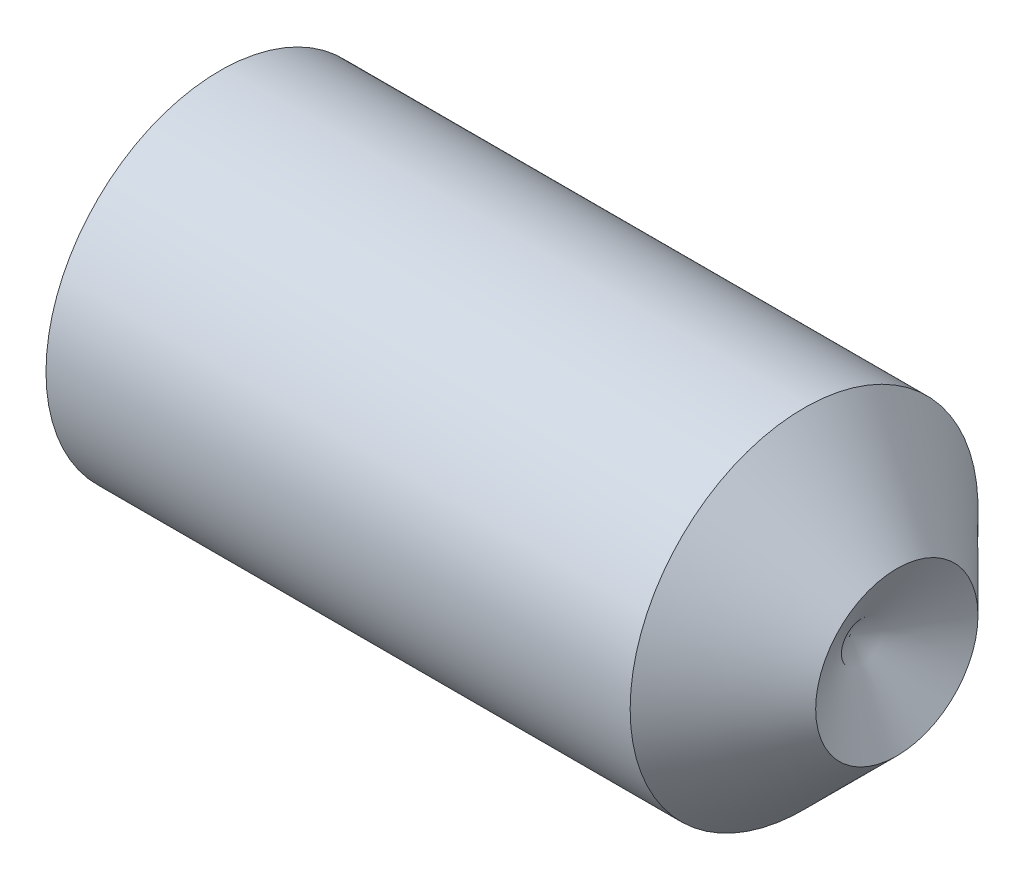
ISO-10303-21;
HEADER;
FILE_DESCRIPTION(('STEP AP214'),'2;1');
FILE_NAME('part.step','',(''),(''),'','','');
FILE_SCHEMA(('AUTOMOTIVE_DESIGN { 1 0 10303 214 1 1 1 1 }'));
ENDSEC;
DATA;
#1=APPLICATION_CONTEXT('core data for automotive mechanical design processes');
#2=APPLICATION_PROTOCOL_DEFINITION('international standard','automotive_design',2000,#1);
#3=PRODUCT_CONTEXT('',#1,'mechanical');
#4=PRODUCT('Part','Part','',(#3));
#5=PRODUCT_RELATED_PRODUCT_CATEGORY('part','',(#4));
#6=PRODUCT_DEFINITION_FORMATION('','',#4);
#7=PRODUCT_DEFINITION_CONTEXT('part definition',#1,'design');
#8=PRODUCT_DEFINITION('design','',#6,#7);
#9=PRODUCT_DEFINITION_SHAPE('','',#8);
#10=(LENGTH_UNIT() NAMED_UNIT(*) SI_UNIT(.MILLI.,.METRE.));
#11=(NAMED_UNIT(*) PLANE_ANGLE_UNIT() SI_UNIT($,.RADIAN.));
#12=(NAMED_UNIT(*) SI_UNIT($,.STERADIAN.) SOLID_ANGLE_UNIT());
#13=UNCERTAINTY_MEASURE_WITH_UNIT(LENGTH_MEASURE(1.E-05),#10,'distance_accuracy_value','');
#14=(GEOMETRIC_REPRESENTATION_CONTEXT(3) GLOBAL_UNCERTAINTY_ASSIGNED_CONTEXT((#13)) GLOBAL_UNIT_ASSIGNED_CONTEXT((#10,
#11,#12)) REPRESENTATION_CONTEXT('',''));
#15=CARTESIAN_POINT('',(0.,0.,0.));
#16=DIRECTION('',(0.,0.,1.));
#17=DIRECTION('',(1.,0.,0.));
#18=AXIS2_PLACEMENT_3D('',#15,#16,#17);
#19=CARTESIAN_POINT('',(0.,0.,0.));
#20=DIRECTION('',(-1.,0.,0.));
#21=DIRECTION('',(0.,0.,1.));
#22=AXIS2_PLACEMENT_3D('',#19,#20,#21);
#23=PLANE('',#22);
#24=CARTESIAN_POINT('',(0.,0.,0.));
#25=DIRECTION('',(-1.,0.,0.));
#26=DIRECTION('',(0.,0.,1.));
#27=AXIS2_PLACEMENT_3D('',#24,#25,#26);
#28=CIRCLE('',#27,1.2195);
#29=CARTESIAN_POINT('',(0.,0.,1.2195));
#30=VERTEX_POINT('',#29);
#31=EDGE_CURVE('E11',#30,#30,#28,.T.);
#32=ORIENTED_EDGE('',*,*,#31,.T.);
#33=EDGE_LOOP('',(#32));
#34=FACE_BOUND('',#33,.T.);
#35=DIRECTION('',(0.,0.,-1.));
#36=VECTOR('',#35,1.);
#37=CARTESIAN_POINT('',(0.,0.75,0.43301270189222));
#38=LINE('',#37,#36);
#39=CARTESIAN_POINT('',(0.,0.75,0.43301270189222));
#40=VERTEX_POINT('',#39);
#41=CARTESIAN_POINT('',(0.,0.75,-0.433012701892219));
#42=VERTEX_POINT('',#41);
#43=EDGE_CURVE('E102',#40,#42,#38,.T.);
#44=ORIENTED_EDGE('',*,*,#43,.F.);
#45=DIRECTION('',(0.,-0.866025403784438,0.5));
#46=VECTOR('',#45,1.);
#47=CARTESIAN_POINT('',(0.,0.75,0.43301270189222));
#48=LINE('',#47,#46);
#49=CARTESIAN_POINT('',(0.,0.,0.866025403784439));
#50=VERTEX_POINT('',#49);
#51=EDGE_CURVE('E55',#40,#50,#48,.T.);
#52=ORIENTED_EDGE('',*,*,#51,.T.);
#53=DIRECTION('',(0.,0.866025403784438,0.5));
#54=VECTOR('',#53,1.);
#55=CARTESIAN_POINT('',(0.,-0.750000000000001,0.43301270189222));
#56=LINE('',#55,#54);
#57=CARTESIAN_POINT('',(0.,-0.750000000000001,0.43301270189222));
#58=VERTEX_POINT('',#57);
#59=EDGE_CURVE('E108',#58,#50,#56,.T.);
#60=ORIENTED_EDGE('',*,*,#59,.F.);
#61=DIRECTION('',(0.,0.,-1.));
#62=VECTOR('',#61,1.);
#63=CARTESIAN_POINT('',(0.,-0.750000000000001,0.43301270189222));
#64=LINE('',#63,#62);
#65=CARTESIAN_POINT('',(0.,-0.750000000000001,-0.433012701892219));
#66=VERTEX_POINT('',#65);
#67=EDGE_CURVE('E128',#58,#66,#64,.T.);
#68=ORIENTED_EDGE('',*,*,#67,.T.);
#69=DIRECTION('',(0.,0.866025403784438,-0.500000000000001));
#70=VECTOR('',#69,1.);
#71=CARTESIAN_POINT('',(0.,-0.750000000000001,-0.433012701892219));
#72=LINE('',#71,#70);
#73=CARTESIAN_POINT('',(0.,0.,-0.866025403784439));
#74=VERTEX_POINT('',#73);
#75=EDGE_CURVE('E131',#66,#74,#72,.T.);
#76=ORIENTED_EDGE('',*,*,#75,.T.);
#77=DIRECTION('',(0.,-0.866025403784438,-0.500000000000001));
#78=VECTOR('',#77,1.);
#79=CARTESIAN_POINT('',(0.,0.75,-0.433012701892219));
#80=LINE('',#79,#78);
#81=EDGE_CURVE('E134',#42,#74,#80,.T.);
#82=ORIENTED_EDGE('',*,*,#81,.F.);
#83=EDGE_LOOP('',(#44,#52,#60,#68,#76,#82));
#84=FACE_BOUND('',#83,.T.);
#85=ADVANCED_FACE('F41',(#34,#84),#23,.T.);
#86=CARTESIAN_POINT('',(0.,0.,0.));
#87=DIRECTION('',(1.,0.,0.));
#88=DIRECTION('',(0.,0.,-1.));
#89=AXIS2_PLACEMENT_3D('',#86,#87,#88);
#90=CONICAL_SURFACE('',#89,1.2195,1.0471975511966);
#91=CARTESIAN_POINT('',(0.161946750507689,0.,0.));
#92=DIRECTION('',(-1.,0.,0.));
#93=DIRECTION('',(0.,0.,1.));
#94=AXIS2_PLACEMENT_3D('',#91,#92,#93);
#95=CIRCLE('',#94,1.5);
#96=CARTESIAN_POINT('',(0.161946750507689,0.,1.5));
#97=VERTEX_POINT('',#96);
#98=EDGE_CURVE('E48',#97,#97,#95,.T.);
#99=ORIENTED_EDGE('',*,*,#98,.T.);
#100=EDGE_LOOP('',(#99));
#101=FACE_BOUND('',#100,.T.);
#102=ORIENTED_EDGE('',*,*,#31,.F.);
#103=EDGE_LOOP('',(#102));
#104=FACE_BOUND('',#103,.T.);
#105=ADVANCED_FACE('F154',(#101,#104),#90,.T.);
#106=CARTESIAN_POINT('',(-12.7,0.,0.));
#107=DIRECTION('',(-1.,0.,0.));
#108=DIRECTION('',(0.,0.,1.));
#109=AXIS2_PLACEMENT_3D('',#106,#107,#108);
#110=CYLINDRICAL_SURFACE('',#109,1.5);
#111=CARTESIAN_POINT('',(5.2,0.,0.));
#112=DIRECTION('',(-1.,0.,0.));
#113=DIRECTION('',(0.,0.,1.));
#114=AXIS2_PLACEMENT_3D('',#111,#112,#113);
#115=CIRCLE('',#114,1.5);
#116=CARTESIAN_POINT('',(5.2,0.,1.5));
#117=VERTEX_POINT('',#116);
#118=EDGE_CURVE('E149',#117,#117,#115,.T.);
#119=ORIENTED_EDGE('',*,*,#118,.T.);
#120=EDGE_LOOP('',(#119));
#121=FACE_BOUND('',#120,.T.);
#122=ORIENTED_EDGE('',*,*,#98,.F.);
#123=EDGE_LOOP('',(#122));
#124=FACE_BOUND('',#123,.T.);
#125=ADVANCED_FACE('F157',(#121,#124),#110,.T.);
#126=CARTESIAN_POINT('',(5.2,0.,0.));
#127=DIRECTION('',(-1.,0.,0.));
#128=DIRECTION('',(0.,0.,1.));
#129=AXIS2_PLACEMENT_3D('',#126,#127,#128);
#130=CONICAL_SURFACE('',#129,1.5,0.785398163397449);
#131=CARTESIAN_POINT('',(6.,0.,0.));
#132=DIRECTION('',(-1.,0.,0.));
#133=DIRECTION('',(0.,0.,1.));
#134=AXIS2_PLACEMENT_3D('',#131,#132,#133);
#135=CIRCLE('',#134,0.7);
#136=CARTESIAN_POINT('',(6.,0.,0.7));
#137=VERTEX_POINT('',#136);
#138=EDGE_CURVE('E109',#137,#137,#135,.T.);
#139=ORIENTED_EDGE('',*,*,#138,.T.);
#140=EDGE_LOOP('',(#139));
#141=FACE_BOUND('',#140,.T.);
#142=ORIENTED_EDGE('',*,*,#118,.F.);
#143=EDGE_LOOP('',(#142));
#144=FACE_BOUND('',#143,.T.);
#145=ADVANCED_FACE('F159',(#141,#144),#130,.T.);
#146=CARTESIAN_POINT('',(5.59585481156726,0.,0.));
#147=DIRECTION('',(1.,0.,0.));
#148=DIRECTION('',(0.,0.,-1.));
#149=AXIS2_PLACEMENT_3D('',#146,#147,#148);
#150=CONICAL_SURFACE('',#149,0.,1.0471975511966);
#151=ORIENTED_EDGE('',*,*,#138,.F.);
#152=EDGE_LOOP('',(#151));
#153=FACE_BOUND('',#152,.T.);
#154=CARTESIAN_POINT('',(5.59585481156726,0.,0.));
#155=VERTEX_POINT('',#154);
#156=VERTEX_LOOP('',#155);
#157=FACE_BOUND('',#156,.T.);
#158=ADVANCED_FACE('F166',(#153,#157),#150,.F.);
#159=CARTESIAN_POINT('',(2.,0.75,0.43301270189222));
#160=DIRECTION('',(0.,-0.5,-0.866025403784439));
#161=DIRECTION('',(0.,0.866025403784438,-0.5));
#162=AXIS2_PLACEMENT_3D('',#159,#160,#161);
#163=PLANE('',#162);
#164=ORIENTED_EDGE('',*,*,#51,.F.);
#165=DIRECTION('',(-1.,0.,0.));
#166=VECTOR('',#165,1.);
#167=CARTESIAN_POINT('',(2.,0.75,0.43301270189222));
#168=LINE('',#167,#166);
#169=CARTESIAN_POINT('',(2.,0.75,0.43301270189222));
#170=VERTEX_POINT('',#169);
#171=EDGE_CURVE('E96',#170,#40,#168,.T.);
#172=ORIENTED_EDGE('',*,*,#171,.F.);
#173=DIRECTION('',(0.,-0.866025403784438,0.5));
#174=VECTOR('',#173,1.);
#175=CARTESIAN_POINT('',(2.,0.75,0.43301270189222));
#176=LINE('',#175,#174);
#177=CARTESIAN_POINT('',(2.,0.,0.866025403784439));
#178=VERTEX_POINT('',#177);
#179=EDGE_CURVE('E91',#170,#178,#176,.T.);
#180=ORIENTED_EDGE('',*,*,#179,.T.);
#181=DIRECTION('',(-1.,0.,0.));
#182=VECTOR('',#181,1.);
#183=CARTESIAN_POINT('',(2.,0.,0.866025403784439));
#184=LINE('',#183,#182);
#185=EDGE_CURVE('E94',#178,#50,#184,.T.);
#186=ORIENTED_EDGE('',*,*,#185,.T.);
#187=EDGE_LOOP('',(#164,#172,#180,#186));
#188=FACE_BOUND('',#187,.T.);
#189=ADVANCED_FACE('F93',(#188),#163,.T.);
#190=CARTESIAN_POINT('',(2.,-0.750000000000001,0.43301270189222));
#191=DIRECTION('',(0.,-0.5,0.866025403784439));
#192=DIRECTION('',(0.,-0.866025403784438,-0.5));
#193=AXIS2_PLACEMENT_3D('',#190,#191,#192);
#194=PLANE('',#193);
#195=ORIENTED_EDGE('',*,*,#59,.T.);
#196=ORIENTED_EDGE('',*,*,#185,.F.);
#197=DIRECTION('',(0.,0.866025403784438,0.5));
#198=VECTOR('',#197,1.);
#199=CARTESIAN_POINT('',(2.,-0.750000000000001,0.43301270189222));
#200=LINE('',#199,#198);
#201=CARTESIAN_POINT('',(2.,-0.750000000000001,0.43301270189222));
#202=VERTEX_POINT('',#201);
#203=EDGE_CURVE('E101',#202,#178,#200,.T.);
#204=ORIENTED_EDGE('',*,*,#203,.F.);
#205=DIRECTION('',(-1.,0.,0.));
#206=VECTOR('',#205,1.);
#207=CARTESIAN_POINT('',(2.,-0.750000000000001,0.43301270189222));
#208=LINE('',#207,#206);
#209=EDGE_CURVE('E110',#202,#58,#208,.T.);
#210=ORIENTED_EDGE('',*,*,#209,.T.);
#211=EDGE_LOOP('',(#195,#196,#204,#210));
#212=FACE_BOUND('',#211,.T.);
#213=ADVANCED_FACE('F106',(#212),#194,.F.);
#214=CARTESIAN_POINT('',(2.,-0.750000000000001,0.43301270189222));
#215=DIRECTION('',(0.,1.,0.));
#216=DIRECTION('',(0.,0.,1.));
#217=AXIS2_PLACEMENT_3D('',#214,#215,#216);
#218=PLANE('',#217);
#219=ORIENTED_EDGE('',*,*,#67,.F.);
#220=ORIENTED_EDGE('',*,*,#209,.F.);
#221=DIRECTION('',(0.,0.,-1.));
#222=VECTOR('',#221,1.);
#223=CARTESIAN_POINT('',(2.,-0.750000000000001,0.43301270189222));
#224=LINE('',#223,#222);
#225=CARTESIAN_POINT('',(2.,-0.750000000000001,-0.433012701892219));
#226=VERTEX_POINT('',#225);
#227=EDGE_CURVE('E115',#202,#226,#224,.T.);
#228=ORIENTED_EDGE('',*,*,#227,.T.);
#229=DIRECTION('',(-1.,0.,0.));
#230=VECTOR('',#229,1.);
#231=CARTESIAN_POINT('',(2.,-0.750000000000001,-0.433012701892219));
#232=LINE('',#231,#230);
#233=EDGE_CURVE('E144',#226,#66,#232,.T.);
#234=ORIENTED_EDGE('',*,*,#233,.T.);
#235=EDGE_LOOP('',(#219,#220,#228,#234));
#236=FACE_BOUND('',#235,.T.);
#237=ADVANCED_FACE('F192',(#236),#218,.T.);
#238=CARTESIAN_POINT('',(2.,-0.750000000000001,-0.433012701892219));
#239=DIRECTION('',(0.,0.500000000000001,0.866025403784438));
#240=DIRECTION('',(0.,-0.866025403784438,0.500000000000001));
#241=AXIS2_PLACEMENT_3D('',#238,#239,#240);
#242=PLANE('',#241);
#243=ORIENTED_EDGE('',*,*,#75,.F.);
#244=ORIENTED_EDGE('',*,*,#233,.F.);
#245=DIRECTION('',(0.,0.866025403784438,-0.500000000000001));
#246=VECTOR('',#245,1.);
#247=CARTESIAN_POINT('',(2.,-0.750000000000001,-0.433012701892219));
#248=LINE('',#247,#246);
#249=CARTESIAN_POINT('',(2.,0.,-0.866025403784439));
#250=VERTEX_POINT('',#249);
#251=EDGE_CURVE('E117',#226,#250,#248,.T.);
#252=ORIENTED_EDGE('',*,*,#251,.T.);
#253=DIRECTION('',(-1.,0.,0.));
#254=VECTOR('',#253,1.);
#255=CARTESIAN_POINT('',(2.,0.,-0.866025403784439));
#256=LINE('',#255,#254);
#257=EDGE_CURVE('E142',#250,#74,#256,.T.);
#258=ORIENTED_EDGE('',*,*,#257,.T.);
#259=EDGE_LOOP('',(#243,#244,#252,#258));
#260=FACE_BOUND('',#259,.T.);
#261=ADVANCED_FACE('F188',(#260),#242,.T.);
#262=CARTESIAN_POINT('',(2.,0.75,-0.433012701892219));
#263=DIRECTION('',(0.,0.500000000000001,-0.866025403784438));
#264=DIRECTION('',(0.,0.866025403784438,0.500000000000001));
#265=AXIS2_PLACEMENT_3D('',#262,#263,#264);
#266=PLANE('',#265);
#267=ORIENTED_EDGE('',*,*,#81,.T.);
#268=ORIENTED_EDGE('',*,*,#257,.F.);
#269=DIRECTION('',(0.,-0.866025403784438,-0.500000000000001));
#270=VECTOR('',#269,1.);
#271=CARTESIAN_POINT('',(2.,0.75,-0.433012701892219));
#272=LINE('',#271,#270);
#273=CARTESIAN_POINT('',(2.,0.75,-0.433012701892219));
#274=VERTEX_POINT('',#273);
#275=EDGE_CURVE('E121',#274,#250,#272,.T.);
#276=ORIENTED_EDGE('',*,*,#275,.F.);
#277=DIRECTION('',(-1.,0.,0.));
#278=VECTOR('',#277,1.);
#279=CARTESIAN_POINT('',(2.,0.75,-0.433012701892219));
#280=LINE('',#279,#278);
#281=EDGE_CURVE('E140',#274,#42,#280,.T.);
#282=ORIENTED_EDGE('',*,*,#281,.T.);
#283=EDGE_LOOP('',(#267,#268,#276,#282));
#284=FACE_BOUND('',#283,.T.);
#285=ADVANCED_FACE('F185',(#284),#266,.F.);
#286=CARTESIAN_POINT('',(2.,0.75,0.43301270189222));
#287=DIRECTION('',(0.,1.,0.));
#288=DIRECTION('',(0.,0.,1.));
#289=AXIS2_PLACEMENT_3D('',#286,#287,#288);
#290=PLANE('',#289);
#291=ORIENTED_EDGE('',*,*,#43,.T.);
#292=ORIENTED_EDGE('',*,*,#281,.F.);
#293=DIRECTION('',(0.,0.,-1.));
#294=VECTOR('',#293,1.);
#295=CARTESIAN_POINT('',(2.,0.75,0.43301270189222));
#296=LINE('',#295,#294);
#297=EDGE_CURVE('E124',#170,#274,#296,.T.);
#298=ORIENTED_EDGE('',*,*,#297,.F.);
#299=ORIENTED_EDGE('',*,*,#171,.T.);
#300=EDGE_LOOP('',(#291,#292,#298,#299));
#301=FACE_BOUND('',#300,.T.);
#302=ADVANCED_FACE('F181',(#301),#290,.F.);
#303=CARTESIAN_POINT('',(2.,1.5,0.));
#304=DIRECTION('',(1.,0.,0.));
#305=DIRECTION('',(0.,0.,-1.));
#306=AXIS2_PLACEMENT_3D('',#303,#304,#305);
#307=PLANE('',#306);
#308=ORIENTED_EDGE('',*,*,#179,.F.);
#309=ORIENTED_EDGE('',*,*,#297,.T.);
#310=ORIENTED_EDGE('',*,*,#275,.T.);
#311=ORIENTED_EDGE('',*,*,#251,.F.);
#312=ORIENTED_EDGE('',*,*,#227,.F.);
#313=ORIENTED_EDGE('',*,*,#203,.T.);
#314=EDGE_LOOP('',(#308,#309,#310,#311,#312,#313));
#315=FACE_BOUND('',#314,.T.);
#316=ADVANCED_FACE('F113',(#315),#307,.F.);
#317=CLOSED_SHELL('',(#85,#105,#125,#145,#158,#189,#213,#237,#261,#285,#302,#316));
#318=MANIFOLD_SOLID_BREP('B2',#317);
#319=ADVANCED_BREP_SHAPE_REPRESENTATION('',(#18,#318),#14);
#320=SHAPE_DEFINITION_REPRESENTATION(#9,#319);
ENDSEC;
END-ISO-10303-21;
